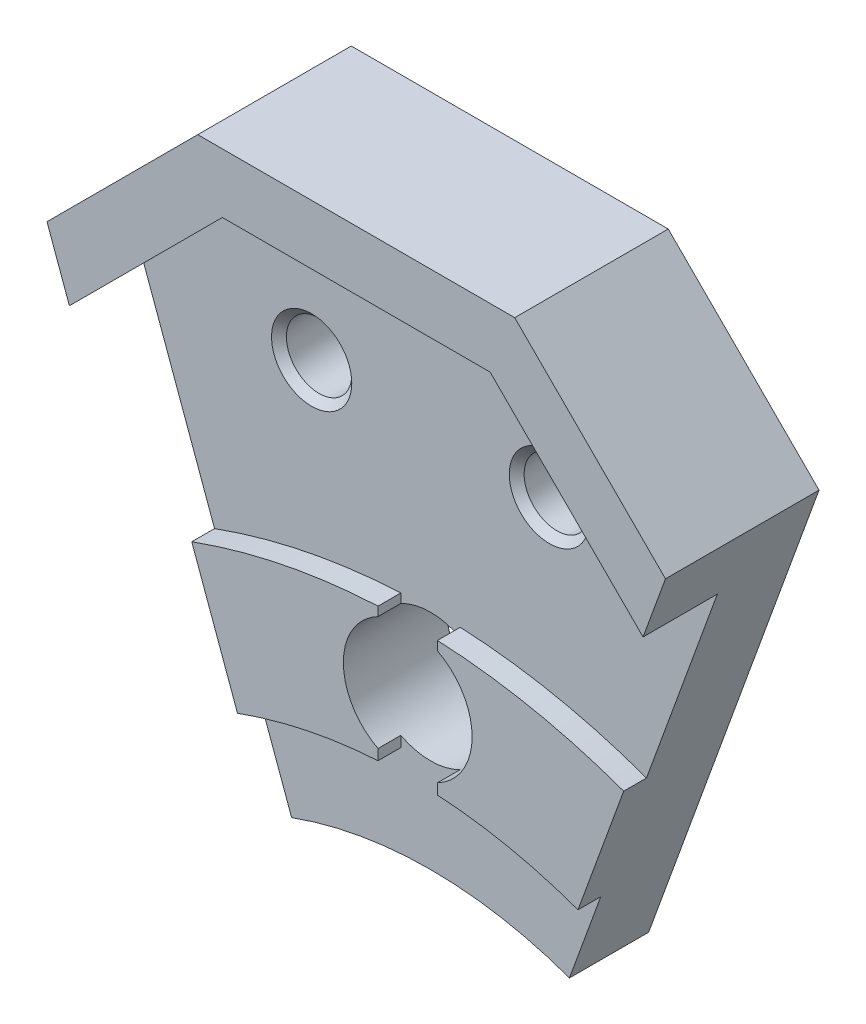
ISO-10303-21;
HEADER;
FILE_DESCRIPTION(('STEP AP214'),'2;1');
FILE_NAME('part.step','',(''),(''),'','','');
FILE_SCHEMA(('AUTOMOTIVE_DESIGN { 1 0 10303 214 1 1 1 1 }'));
ENDSEC;
DATA;
#1=APPLICATION_CONTEXT('core data for automotive mechanical design processes');
#2=APPLICATION_PROTOCOL_DEFINITION('international standard','automotive_design',2000,#1);
#3=PRODUCT_CONTEXT('',#1,'mechanical');
#4=PRODUCT('Part','Part','',(#3));
#5=PRODUCT_RELATED_PRODUCT_CATEGORY('part','',(#4));
#6=PRODUCT_DEFINITION_FORMATION('','',#4);
#7=PRODUCT_DEFINITION_CONTEXT('part definition',#1,'design');
#8=PRODUCT_DEFINITION('design','',#6,#7);
#9=PRODUCT_DEFINITION_SHAPE('','',#8);
#10=(LENGTH_UNIT() NAMED_UNIT(*) SI_UNIT(.MILLI.,.METRE.));
#11=(NAMED_UNIT(*) PLANE_ANGLE_UNIT() SI_UNIT($,.RADIAN.));
#12=(NAMED_UNIT(*) SI_UNIT($,.STERADIAN.) SOLID_ANGLE_UNIT());
#13=UNCERTAINTY_MEASURE_WITH_UNIT(LENGTH_MEASURE(1.E-05),#10,'distance_accuracy_value','');
#14=(GEOMETRIC_REPRESENTATION_CONTEXT(3) GLOBAL_UNCERTAINTY_ASSIGNED_CONTEXT((#13)) GLOBAL_UNIT_ASSIGNED_CONTEXT((#10,
#11,#12)) REPRESENTATION_CONTEXT('',''));
#15=CARTESIAN_POINT('',(0.,0.,0.));
#16=DIRECTION('',(0.,0.,1.));
#17=DIRECTION('',(1.,0.,0.));
#18=AXIS2_PLACEMENT_3D('',#15,#16,#17);
#19=CARTESIAN_POINT('',(0.,0.,2.));
#20=DIRECTION('',(0.,0.,1.));
#21=DIRECTION('',(1.,0.,0.));
#22=AXIS2_PLACEMENT_3D('',#19,#20,#21);
#23=PLANE('',#22);
#24=DIRECTION('',(0.,-1.,0.));
#25=VECTOR('',#24,1.);
#26=CARTESIAN_POINT('',(-1.49999999999999,0.,2.));
#27=LINE('',#26,#25);
#28=CARTESIAN_POINT('',(-1.5,25.6168593513323,2.));
#29=VERTEX_POINT('',#28);
#30=CARTESIAN_POINT('',(-1.5,25.080183910809,2.));
#31=VERTEX_POINT('',#30);
#32=EDGE_CURVE('E55',#29,#31,#27,.T.);
#33=ORIENTED_EDGE('',*,*,#32,.T.);
#34=CARTESIAN_POINT('',(0.,0.,2.));
#35=DIRECTION('',(0.,0.,1.));
#36=DIRECTION('',(1.,0.,0.));
#37=AXIS2_PLACEMENT_3D('',#34,#35,#36);
#38=CIRCLE('',#37,25.125);
#39=CARTESIAN_POINT('',(-8.59325610105729,23.609777097246,2.));
#40=VERTEX_POINT('',#39);
#41=EDGE_CURVE('E223',#31,#40,#38,.T.);
#42=ORIENTED_EDGE('',*,*,#41,.T.);
#43=DIRECTION('',(0.342020143325669,-0.939692620785908,0.));
#44=VECTOR('',#43,1.);
#45=CARTESIAN_POINT('',(-7.01141293817607,19.2636987261112,2.));
#46=LINE('',#45,#44);
#47=CARTESIAN_POINT('',(-7.01141293817607,19.2636987261112,2.));
#48=VERTEX_POINT('',#47);
#49=EDGE_CURVE('E206',#40,#48,#46,.T.);
#50=ORIENTED_EDGE('',*,*,#49,.T.);
#51=CARTESIAN_POINT('',(0.,0.,2.));
#52=DIRECTION('',(0.,0.,-1.));
#53=DIRECTION('',(1.,0.,0.));
#54=AXIS2_PLACEMENT_3D('',#51,#52,#53);
#55=CIRCLE('',#54,20.5);
#56=CARTESIAN_POINT('',(7.01141293817622,19.2636987261111,2.));
#57=VERTEX_POINT('',#56);
#58=EDGE_CURVE('E313',#48,#57,#55,.T.);
#59=ORIENTED_EDGE('',*,*,#58,.T.);
#60=DIRECTION('',(0.342020143325663,0.93969262078591,0.));
#61=VECTOR('',#60,1.);
#62=CARTESIAN_POINT('',(7.01141293817622,19.2636987261111,2.));
#63=LINE('',#62,#61);
#64=CARTESIAN_POINT('',(8.59325610105742,23.609777097246,2.));
#65=VERTEX_POINT('',#64);
#66=EDGE_CURVE('E316',#57,#65,#63,.T.);
#67=ORIENTED_EDGE('',*,*,#66,.T.);
#68=CARTESIAN_POINT('',(0.,0.,2.));
#69=DIRECTION('',(0.,0.,1.));
#70=DIRECTION('',(1.,0.,0.));
#71=AXIS2_PLACEMENT_3D('',#68,#69,#70);
#72=CIRCLE('',#71,25.125);
#73=CARTESIAN_POINT('',(1.5,25.080183910809,2.));
#74=VERTEX_POINT('',#73);
#75=EDGE_CURVE('E264',#65,#74,#72,.T.);
#76=ORIENTED_EDGE('',*,*,#75,.T.);
#77=DIRECTION('',(0.,1.,0.));
#78=VECTOR('',#77,1.);
#79=CARTESIAN_POINT('',(1.49999999999999,0.,2.));
#80=LINE('',#79,#78);
#81=CARTESIAN_POINT('',(1.5,25.6168593513323,2.));
#82=VERTEX_POINT('',#81);
#83=EDGE_CURVE('E255',#74,#82,#80,.T.);
#84=ORIENTED_EDGE('',*,*,#83,.T.);
#85=CARTESIAN_POINT('',(0.,28.5,2.));
#86=DIRECTION('',(0.,0.,1.));
#87=DIRECTION('',(1.,0.,0.));
#88=AXIS2_PLACEMENT_3D('',#85,#86,#87);
#89=CIRCLE('',#88,3.25);
#90=EDGE_CURVE('E308',#29,#82,#89,.T.);
#91=ORIENTED_EDGE('',*,*,#90,.F.);
#92=EDGE_LOOP('',(#33,#42,#50,#59,#67,#76,#84,#91));
#93=FACE_BOUND('',#92,.T.);
#94=ADVANCED_FACE('F40',(#93),#23,.T.);
#95=CARTESIAN_POINT('',(-6.,39.7720779386421,2.));
#96=DIRECTION('',(0.,0.,1.));
#97=DIRECTION('',(1.,0.,0.));
#98=AXIS2_PLACEMENT_3D('',#95,#96,#97);
#99=CIRCLE('',#98,2.025);
#100=CARTESIAN_POINT('',(-3.975,39.7720779386421,2.));
#101=VERTEX_POINT('',#100);
#102=EDGE_CURVE('E782',#101,#101,#99,.T.);
#103=ORIENTED_EDGE('',*,*,#102,.F.);
#104=EDGE_LOOP('',(#103));
#105=FACE_BOUND('',#104,.T.);
#106=CARTESIAN_POINT('',(6.,39.7720779386421,2.));
#107=DIRECTION('',(0.,0.,1.));
#108=DIRECTION('',(1.,0.,0.));
#109=AXIS2_PLACEMENT_3D('',#106,#107,#108);
#110=CIRCLE('',#109,2.025);
#111=CARTESIAN_POINT('',(8.025,39.7720779386421,2.));
#112=VERTEX_POINT('',#111);
#113=EDGE_CURVE('E789',#112,#112,#110,.T.);
#114=ORIENTED_EDGE('',*,*,#113,.F.);
#115=EDGE_LOOP('',(#114));
#116=FACE_BOUND('',#115,.T.);
#117=CARTESIAN_POINT('',(0.,0.,2.));
#118=DIRECTION('',(0.,0.,1.));
#119=DIRECTION('',(1.,0.,0.));
#120=AXIS2_PLACEMENT_3D('',#117,#118,#119);
#121=CIRCLE('',#120,31.875);
#122=CARTESIAN_POINT('',(-10.9018920685056,29.9527022875509,2.));
#123=VERTEX_POINT('',#122);
#124=CARTESIAN_POINT('',(-1.5,31.839686320691,2.));
#125=VERTEX_POINT('',#124);
#126=EDGE_CURVE('E63',#123,#125,#121,.F.);
#127=ORIENTED_EDGE('',*,*,#126,.T.);
#128=DIRECTION('',(0.,-1.,0.));
#129=VECTOR('',#128,1.);
#130=CARTESIAN_POINT('',(-1.5,0.,2.));
#131=LINE('',#130,#129);
#132=CARTESIAN_POINT('',(-1.5,31.3831406486677,2.));
#133=VERTEX_POINT('',#132);
#134=EDGE_CURVE('E213',#125,#133,#131,.T.);
#135=ORIENTED_EDGE('',*,*,#134,.T.);
#136=CARTESIAN_POINT('',(1.5,31.3831406486677,2.));
#137=VERTEX_POINT('',#136);
#138=EDGE_CURVE('E304',#137,#133,#89,.T.);
#139=ORIENTED_EDGE('',*,*,#138,.F.);
#140=DIRECTION('',(0.,1.,0.));
#141=VECTOR('',#140,1.);
#142=CARTESIAN_POINT('',(1.50000000000003,0.,2.));
#143=LINE('',#142,#141);
#144=CARTESIAN_POINT('',(1.5,31.839686320691,2.));
#145=VERTEX_POINT('',#144);
#146=EDGE_CURVE('E258',#137,#145,#143,.T.);
#147=ORIENTED_EDGE('',*,*,#146,.T.);
#148=CARTESIAN_POINT('',(0.,0.,2.));
#149=DIRECTION('',(0.,0.,1.));
#150=DIRECTION('',(1.,0.,0.));
#151=AXIS2_PLACEMENT_3D('',#148,#149,#150);
#152=CIRCLE('',#151,31.875);
#153=CARTESIAN_POINT('',(10.9018920685056,29.9527022875508,2.));
#154=VERTEX_POINT('',#153);
#155=EDGE_CURVE('E261',#145,#154,#152,.F.);
#156=ORIENTED_EDGE('',*,*,#155,.T.);
#157=CARTESIAN_POINT('',(14.4783685770084,39.7789907358724,2.));
#158=VERTEX_POINT('',#157);
#159=EDGE_CURVE('E315',#154,#158,#63,.T.);
#160=ORIENTED_EDGE('',*,*,#159,.T.);
#161=DIRECTION('',(-0.707106781186551,0.707106781186544,0.));
#162=VECTOR('',#161,1.);
#163=CARTESIAN_POINT('',(27.1286796564403,27.1286796564406,2.));
#164=LINE('',#163,#162);
#165=CARTESIAN_POINT('',(6.75735931288072,47.5,2.));
#166=VERTEX_POINT('',#165);
#167=EDGE_CURVE('E297',#158,#166,#164,.T.);
#168=ORIENTED_EDGE('',*,*,#167,.T.);
#169=DIRECTION('',(-1.,0.,0.));
#170=VECTOR('',#169,1.);
#171=CARTESIAN_POINT('',(0.,47.5,2.));
#172=LINE('',#171,#170);
#173=CARTESIAN_POINT('',(-6.75735931288072,47.5,2.));
#174=VERTEX_POINT('',#173);
#175=EDGE_CURVE('E11',#166,#174,#172,.T.);
#176=ORIENTED_EDGE('',*,*,#175,.T.);
#177=DIRECTION('',(-0.707106781186551,-0.707106781186544,0.));
#178=VECTOR('',#177,1.);
#179=CARTESIAN_POINT('',(-27.1286796564403,27.1286796564406,2.));
#180=LINE('',#179,#178);
#181=CARTESIAN_POINT('',(-14.4783685770084,39.7789907358724,2.));
#182=VERTEX_POINT('',#181);
#183=EDGE_CURVE('E300',#174,#182,#180,.T.);
#184=ORIENTED_EDGE('',*,*,#183,.T.);
#185=EDGE_CURVE('E311',#182,#123,#46,.T.);
#186=ORIENTED_EDGE('',*,*,#185,.T.);
#187=EDGE_LOOP('',(#127,#135,#139,#147,#156,#160,#168,#176,#184,#186));
#188=FACE_BOUND('',#187,.T.);
#189=ADVANCED_FACE('F409',(#105,#116,#188),#23,.T.);
#190=CARTESIAN_POINT('',(0.,0.,-2.));
#191=DIRECTION('',(0.,0.,1.));
#192=DIRECTION('',(1.,0.,0.));
#193=AXIS2_PLACEMENT_3D('',#190,#191,#192);
#194=PLANE('',#193);
#195=CARTESIAN_POINT('',(-6.,39.7720779386421,-2.));
#196=DIRECTION('',(0.,0.,1.));
#197=DIRECTION('',(1.,0.,0.));
#198=AXIS2_PLACEMENT_3D('',#195,#196,#197);
#199=CIRCLE('',#198,1.64999999999999);
#200=CARTESIAN_POINT('',(-4.35000000000001,39.7720779386421,-2.));
#201=VERTEX_POINT('',#200);
#202=EDGE_CURVE('E784',#201,#201,#199,.T.);
#203=ORIENTED_EDGE('',*,*,#202,.T.);
#204=EDGE_LOOP('',(#203));
#205=FACE_BOUND('',#204,.T.);
#206=CARTESIAN_POINT('',(6.,39.7720779386421,-2.));
#207=DIRECTION('',(0.,0.,1.));
#208=DIRECTION('',(1.,0.,0.));
#209=AXIS2_PLACEMENT_3D('',#206,#207,#208);
#210=CIRCLE('',#209,1.64999999999999);
#211=CARTESIAN_POINT('',(7.64999999999999,39.7720779386421,-2.));
#212=VERTEX_POINT('',#211);
#213=EDGE_CURVE('E378',#212,#212,#210,.T.);
#214=ORIENTED_EDGE('',*,*,#213,.T.);
#215=EDGE_LOOP('',(#214));
#216=FACE_BOUND('',#215,.T.);
#217=DIRECTION('',(-0.707106781186551,-0.707106781186544,0.));
#218=VECTOR('',#217,1.);
#219=CARTESIAN_POINT('',(-8.,50.5,-2.));
#220=LINE('',#219,#218);
#221=CARTESIAN_POINT('',(-8.,50.5,-2.));
#222=VERTEX_POINT('',#221);
#223=CARTESIAN_POINT('',(-15.6105009989662,42.8894990010339,-2.));
#224=VERTEX_POINT('',#223);
#225=EDGE_CURVE('E307',#222,#224,#220,.T.);
#226=ORIENTED_EDGE('',*,*,#225,.F.);
#227=DIRECTION('',(-1.,0.,0.));
#228=VECTOR('',#227,1.);
#229=CARTESIAN_POINT('',(-8.,50.5,-2.));
#230=LINE('',#229,#228);
#231=CARTESIAN_POINT('',(8.,50.5,-2.));
#232=VERTEX_POINT('',#231);
#233=EDGE_CURVE('E332',#232,#222,#230,.T.);
#234=ORIENTED_EDGE('',*,*,#233,.F.);
#235=DIRECTION('',(-0.707106781186551,0.707106781186544,0.));
#236=VECTOR('',#235,1.);
#237=CARTESIAN_POINT('',(8.,50.5,-2.));
#238=LINE('',#237,#236);
#239=CARTESIAN_POINT('',(15.6105009989662,42.8894990010339,-2.));
#240=VERTEX_POINT('',#239);
#241=EDGE_CURVE('E329',#240,#232,#238,.T.);
#242=ORIENTED_EDGE('',*,*,#241,.F.);
#243=DIRECTION('',(0.342020143325663,0.93969262078591,0.));
#244=VECTOR('',#243,1.);
#245=CARTESIAN_POINT('',(7.01141293817622,19.2636987261111,-2.));
#246=LINE('',#245,#244);
#247=CARTESIAN_POINT('',(7.01141293817622,19.2636987261111,-2.));
#248=VERTEX_POINT('',#247);
#249=EDGE_CURVE('E326',#248,#240,#246,.T.);
#250=ORIENTED_EDGE('',*,*,#249,.F.);
#251=CARTESIAN_POINT('',(0.,0.,-2.));
#252=DIRECTION('',(0.,0.,-1.));
#253=DIRECTION('',(1.,0.,0.));
#254=AXIS2_PLACEMENT_3D('',#251,#252,#253);
#255=CIRCLE('',#254,20.5);
#256=CARTESIAN_POINT('',(-7.01141293817607,19.2636987261112,-2.));
#257=VERTEX_POINT('',#256);
#258=EDGE_CURVE('E324',#257,#248,#255,.T.);
#259=ORIENTED_EDGE('',*,*,#258,.F.);
#260=DIRECTION('',(0.342020143325669,-0.939692620785908,0.));
#261=VECTOR('',#260,1.);
#262=CARTESIAN_POINT('',(-7.01141293817607,19.2636987261112,-2.));
#263=LINE('',#262,#261);
#264=EDGE_CURVE('E322',#224,#257,#263,.T.);
#265=ORIENTED_EDGE('',*,*,#264,.F.);
#266=EDGE_LOOP('',(#226,#234,#242,#250,#259,#265));
#267=FACE_BOUND('',#266,.T.);
#268=CARTESIAN_POINT('',(0.,28.5,-2.));
#269=DIRECTION('',(0.,0.,1.));
#270=DIRECTION('',(1.,0.,0.));
#271=AXIS2_PLACEMENT_3D('',#268,#269,#270);
#272=CIRCLE('',#271,3.25);
#273=CARTESIAN_POINT('',(3.25,28.5,-2.));
#274=VERTEX_POINT('',#273);
#275=EDGE_CURVE('E303',#274,#274,#272,.T.);
#276=ORIENTED_EDGE('',*,*,#275,.T.);
#277=EDGE_LOOP('',(#276));
#278=FACE_BOUND('',#277,.T.);
#279=ADVANCED_FACE('F353',(#205,#216,#267,#278),#194,.F.);
#280=CARTESIAN_POINT('',(-8.,50.5,2.));
#281=DIRECTION('',(0.707106781186544,-0.707106781186551,0.));
#282=DIRECTION('',(0.707106781186551,0.707106781186544,0.));
#283=AXIS2_PLACEMENT_3D('',#280,#281,#282);
#284=PLANE('',#283);
#285=DIRECTION('',(0.,0.,-1.));
#286=VECTOR('',#285,1.);
#287=CARTESIAN_POINT('',(-8.,50.5,2.));
#288=LINE('',#287,#286);
#289=CARTESIAN_POINT('',(-8.,50.5,5.75));
#290=VERTEX_POINT('',#289);
#291=EDGE_CURVE('E319',#290,#222,#288,.T.);
#292=ORIENTED_EDGE('',*,*,#291,.T.);
#293=ORIENTED_EDGE('',*,*,#225,.T.);
#294=DIRECTION('',(0.,0.,-1.));
#295=VECTOR('',#294,1.);
#296=CARTESIAN_POINT('',(-15.6105009989662,42.8894990010339,2.));
#297=LINE('',#296,#295);
#298=CARTESIAN_POINT('',(-15.6105009989662,42.8894990010339,5.75));
#299=VERTEX_POINT('',#298);
#300=EDGE_CURVE('E48',#299,#224,#297,.T.);
#301=ORIENTED_EDGE('',*,*,#300,.F.);
#302=DIRECTION('',(-0.707106781186551,-0.707106781186544,0.));
#303=VECTOR('',#302,1.);
#304=CARTESIAN_POINT('',(-8.,50.5,5.75));
#305=LINE('',#304,#303);
#306=EDGE_CURVE('E276',#290,#299,#305,.T.);
#307=ORIENTED_EDGE('',*,*,#306,.F.);
#308=EDGE_LOOP('',(#292,#293,#301,#307));
#309=FACE_BOUND('',#308,.T.);
#310=ADVANCED_FACE('F42',(#309),#284,.F.);
#311=CARTESIAN_POINT('',(-7.01141293817607,19.2636987261112,2.));
#312=DIRECTION('',(0.939692620785908,0.342020143325669,0.));
#313=DIRECTION('',(-0.342020143325669,0.939692620785908,0.));
#314=AXIS2_PLACEMENT_3D('',#311,#312,#313);
#315=PLANE('',#314);
#316=ORIENTED_EDGE('',*,*,#49,.F.);
#317=DIRECTION('',(0.,0.,-1.));
#318=VECTOR('',#317,1.);
#319=CARTESIAN_POINT('',(-8.59325610105729,23.609777097246,3.15));
#320=LINE('',#319,#318);
#321=CARTESIAN_POINT('',(-8.59325610105729,23.609777097246,3.15));
#322=VERTEX_POINT('',#321);
#323=EDGE_CURVE('E201',#322,#40,#320,.T.);
#324=ORIENTED_EDGE('',*,*,#323,.F.);
#325=DIRECTION('',(0.342020143325669,-0.939692620785908,0.));
#326=VECTOR('',#325,1.);
#327=CARTESIAN_POINT('',(-10.9018920685056,29.9527022875509,3.15));
#328=LINE('',#327,#326);
#329=CARTESIAN_POINT('',(-10.9018920685056,29.9527022875509,3.15));
#330=VERTEX_POINT('',#329);
#331=EDGE_CURVE('E190',#330,#322,#328,.T.);
#332=ORIENTED_EDGE('',*,*,#331,.F.);
#333=DIRECTION('',(0.,0.,-1.));
#334=VECTOR('',#333,1.);
#335=CARTESIAN_POINT('',(-10.9018920685056,29.9527022875509,3.15));
#336=LINE('',#335,#334);
#337=EDGE_CURVE('E208',#330,#123,#336,.T.);
#338=ORIENTED_EDGE('',*,*,#337,.T.);
#339=ORIENTED_EDGE('',*,*,#185,.F.);
#340=DIRECTION('',(0.,0.,-1.));
#341=VECTOR('',#340,1.);
#342=CARTESIAN_POINT('',(-14.4783685770084,39.7789907358724,5.75));
#343=LINE('',#342,#341);
#344=CARTESIAN_POINT('',(-14.4783685770084,39.7789907358724,5.75));
#345=VERTEX_POINT('',#344);
#346=EDGE_CURVE('E295',#345,#182,#343,.T.);
#347=ORIENTED_EDGE('',*,*,#346,.F.);
#348=DIRECTION('',(0.342020143325669,-0.939692620785908,0.));
#349=VECTOR('',#348,1.);
#350=CARTESIAN_POINT('',(-15.6105009989662,42.8894990010339,5.75));
#351=LINE('',#350,#349);
#352=EDGE_CURVE('E279',#299,#345,#351,.T.);
#353=ORIENTED_EDGE('',*,*,#352,.F.);
#354=ORIENTED_EDGE('',*,*,#300,.T.);
#355=ORIENTED_EDGE('',*,*,#264,.T.);
#356=DIRECTION('',(0.,0.,-1.));
#357=VECTOR('',#356,1.);
#358=CARTESIAN_POINT('',(-7.01141293817607,19.2636987261112,2.));
#359=LINE('',#358,#357);
#360=EDGE_CURVE('E343',#48,#257,#359,.T.);
#361=ORIENTED_EDGE('',*,*,#360,.F.);
#362=EDGE_LOOP('',(#316,#324,#332,#338,#339,#347,#353,#354,#355,#361));
#363=FACE_BOUND('',#362,.T.);
#364=ADVANCED_FACE('F204',(#363),#315,.F.);
#365=CARTESIAN_POINT('',(0.,0.,2.));
#366=DIRECTION('',(0.,0.,-1.));
#367=DIRECTION('',(-1.,0.,0.));
#368=AXIS2_PLACEMENT_3D('',#365,#366,#367);
#369=CYLINDRICAL_SURFACE('',#368,20.5);
#370=ORIENTED_EDGE('',*,*,#258,.T.);
#371=DIRECTION('',(0.,0.,-1.));
#372=VECTOR('',#371,1.);
#373=CARTESIAN_POINT('',(7.01141293817622,19.2636987261111,2.));
#374=LINE('',#373,#372);
#375=EDGE_CURVE('E340',#57,#248,#374,.T.);
#376=ORIENTED_EDGE('',*,*,#375,.F.);
#377=ORIENTED_EDGE('',*,*,#58,.F.);
#378=ORIENTED_EDGE('',*,*,#360,.T.);
#379=EDGE_LOOP('',(#370,#376,#377,#378));
#380=FACE_BOUND('',#379,.T.);
#381=ADVANCED_FACE('F372',(#380),#369,.F.);
#382=CARTESIAN_POINT('',(7.01141293817622,19.2636987261111,2.));
#383=DIRECTION('',(-0.93969262078591,0.342020143325663,0.));
#384=DIRECTION('',(-0.342020143325663,-0.939692620785911,0.));
#385=AXIS2_PLACEMENT_3D('',#382,#383,#384);
#386=PLANE('',#385);
#387=ORIENTED_EDGE('',*,*,#159,.F.);
#388=DIRECTION('',(0.,0.,-1.));
#389=VECTOR('',#388,1.);
#390=CARTESIAN_POINT('',(10.9018920685056,29.9527022875508,3.15));
#391=LINE('',#390,#389);
#392=CARTESIAN_POINT('',(10.9018920685056,29.9527022875508,3.15));
#393=VERTEX_POINT('',#392);
#394=EDGE_CURVE('E250',#393,#154,#391,.T.);
#395=ORIENTED_EDGE('',*,*,#394,.F.);
#396=DIRECTION('',(0.342020143325663,0.93969262078591,0.));
#397=VECTOR('',#396,1.);
#398=CARTESIAN_POINT('',(8.59325610105742,23.609777097246,3.15));
#399=LINE('',#398,#397);
#400=CARTESIAN_POINT('',(8.59325610105742,23.609777097246,3.15));
#401=VERTEX_POINT('',#400);
#402=EDGE_CURVE('E228',#401,#393,#399,.T.);
#403=ORIENTED_EDGE('',*,*,#402,.F.);
#404=DIRECTION('',(0.,0.,-1.));
#405=VECTOR('',#404,1.);
#406=CARTESIAN_POINT('',(8.59325610105742,23.609777097246,3.15));
#407=LINE('',#406,#405);
#408=EDGE_CURVE('E252',#401,#65,#407,.T.);
#409=ORIENTED_EDGE('',*,*,#408,.T.);
#410=ORIENTED_EDGE('',*,*,#66,.F.);
#411=ORIENTED_EDGE('',*,*,#375,.T.);
#412=ORIENTED_EDGE('',*,*,#249,.T.);
#413=DIRECTION('',(0.,0.,-1.));
#414=VECTOR('',#413,1.);
#415=CARTESIAN_POINT('',(15.6105009989662,42.8894990010339,2.));
#416=LINE('',#415,#414);
#417=CARTESIAN_POINT('',(15.6105009989662,42.8894990010339,5.75));
#418=VERTEX_POINT('',#417);
#419=EDGE_CURVE('E338',#418,#240,#416,.T.);
#420=ORIENTED_EDGE('',*,*,#419,.F.);
#421=DIRECTION('',(0.342020143325663,0.939692620785911,0.));
#422=VECTOR('',#421,1.);
#423=CARTESIAN_POINT('',(14.4783685770084,39.7789907358724,5.75));
#424=LINE('',#423,#422);
#425=CARTESIAN_POINT('',(14.4783685770084,39.7789907358724,5.75));
#426=VERTEX_POINT('',#425);
#427=EDGE_CURVE('E267',#426,#418,#424,.T.);
#428=ORIENTED_EDGE('',*,*,#427,.F.);
#429=DIRECTION('',(0.,0.,-1.));
#430=VECTOR('',#429,1.);
#431=CARTESIAN_POINT('',(14.4783685770084,39.7789907358724,5.75));
#432=LINE('',#431,#430);
#433=EDGE_CURVE('E287',#426,#158,#432,.T.);
#434=ORIENTED_EDGE('',*,*,#433,.T.);
#435=EDGE_LOOP('',(#387,#395,#403,#409,#410,#411,#412,#420,#428,#434));
#436=FACE_BOUND('',#435,.T.);
#437=ADVANCED_FACE('F367',(#436),#386,.F.);
#438=CARTESIAN_POINT('',(8.,50.5,2.));
#439=DIRECTION('',(-0.707106781186544,-0.707106781186551,0.));
#440=DIRECTION('',(0.707106781186551,-0.707106781186544,0.));
#441=AXIS2_PLACEMENT_3D('',#438,#439,#440);
#442=PLANE('',#441);
#443=ORIENTED_EDGE('',*,*,#419,.T.);
#444=ORIENTED_EDGE('',*,*,#241,.T.);
#445=DIRECTION('',(0.,0.,-1.));
#446=VECTOR('',#445,1.);
#447=CARTESIAN_POINT('',(8.,50.5,2.));
#448=LINE('',#447,#446);
#449=CARTESIAN_POINT('',(8.,50.5,5.75));
#450=VERTEX_POINT('',#449);
#451=EDGE_CURVE('E336',#450,#232,#448,.T.);
#452=ORIENTED_EDGE('',*,*,#451,.F.);
#453=DIRECTION('',(-0.707106781186551,0.707106781186544,0.));
#454=VECTOR('',#453,1.);
#455=CARTESIAN_POINT('',(15.6105009989662,42.8894990010339,5.75));
#456=LINE('',#455,#454);
#457=EDGE_CURVE('E270',#418,#450,#456,.T.);
#458=ORIENTED_EDGE('',*,*,#457,.F.);
#459=EDGE_LOOP('',(#443,#444,#452,#458));
#460=FACE_BOUND('',#459,.T.);
#461=ADVANCED_FACE('F362',(#460),#442,.F.);
#462=CARTESIAN_POINT('',(-8.,50.5,2.));
#463=DIRECTION('',(0.,-1.,0.));
#464=DIRECTION('',(0.,0.,-1.));
#465=AXIS2_PLACEMENT_3D('',#462,#463,#464);
#466=PLANE('',#465);
#467=ORIENTED_EDGE('',*,*,#451,.T.);
#468=ORIENTED_EDGE('',*,*,#233,.T.);
#469=ORIENTED_EDGE('',*,*,#291,.F.);
#470=DIRECTION('',(-1.,0.,0.));
#471=VECTOR('',#470,1.);
#472=CARTESIAN_POINT('',(8.,50.5,5.75));
#473=LINE('',#472,#471);
#474=EDGE_CURVE('E273',#450,#290,#473,.T.);
#475=ORIENTED_EDGE('',*,*,#474,.F.);
#476=EDGE_LOOP('',(#467,#468,#469,#475));
#477=FACE_BOUND('',#476,.T.);
#478=ADVANCED_FACE('F359',(#477),#466,.F.);
#479=CARTESIAN_POINT('',(0.,28.5,2.));
#480=DIRECTION('',(0.,0.,-1.));
#481=DIRECTION('',(-1.,0.,0.));
#482=AXIS2_PLACEMENT_3D('',#479,#480,#481);
#483=CYLINDRICAL_SURFACE('',#482,3.25);
#484=ORIENTED_EDGE('',*,*,#138,.T.);
#485=DIRECTION('',(0.,0.,-1.));
#486=VECTOR('',#485,1.);
#487=CARTESIAN_POINT('',(-1.5,31.3831406486677,3.15));
#488=LINE('',#487,#486);
#489=CARTESIAN_POINT('',(-1.5,31.3831406486677,3.15));
#490=VERTEX_POINT('',#489);
#491=EDGE_CURVE('E380',#490,#133,#488,.T.);
#492=ORIENTED_EDGE('',*,*,#491,.F.);
#493=CARTESIAN_POINT('',(0.,28.5,3.15));
#494=DIRECTION('',(0.,0.,-1.));
#495=DIRECTION('',(1.,0.,0.));
#496=AXIS2_PLACEMENT_3D('',#493,#494,#495);
#497=CIRCLE('',#496,3.25);
#498=CARTESIAN_POINT('',(-1.5,25.6168593513323,3.15));
#499=VERTEX_POINT('',#498);
#500=EDGE_CURVE('E217',#499,#490,#497,.T.);
#501=ORIENTED_EDGE('',*,*,#500,.F.);
#502=DIRECTION('',(0.,0.,-1.));
#503=VECTOR('',#502,1.);
#504=CARTESIAN_POINT('',(-1.5,25.6168593513323,3.15));
#505=LINE('',#504,#503);
#506=EDGE_CURVE('E377',#499,#29,#505,.T.);
#507=ORIENTED_EDGE('',*,*,#506,.T.);
#508=ORIENTED_EDGE('',*,*,#90,.T.);
#509=DIRECTION('',(0.,0.,-1.));
#510=VECTOR('',#509,1.);
#511=CARTESIAN_POINT('',(1.5,25.6168593513323,3.15));
#512=LINE('',#511,#510);
#513=CARTESIAN_POINT('',(1.5,25.6168593513323,3.15));
#514=VERTEX_POINT('',#513);
#515=EDGE_CURVE('E241',#514,#82,#512,.T.);
#516=ORIENTED_EDGE('',*,*,#515,.F.);
#517=CARTESIAN_POINT('',(0.,28.5,3.15));
#518=DIRECTION('',(0.,0.,-1.));
#519=DIRECTION('',(1.,0.,0.));
#520=AXIS2_PLACEMENT_3D('',#517,#518,#519);
#521=CIRCLE('',#520,3.25);
#522=CARTESIAN_POINT('',(1.5,31.3831406486677,3.15));
#523=VERTEX_POINT('',#522);
#524=EDGE_CURVE('E234',#523,#514,#521,.T.);
#525=ORIENTED_EDGE('',*,*,#524,.F.);
#526=DIRECTION('',(0.,0.,-1.));
#527=VECTOR('',#526,1.);
#528=CARTESIAN_POINT('',(1.5,31.3831406486677,3.15));
#529=LINE('',#528,#527);
#530=EDGE_CURVE('E244',#523,#137,#529,.T.);
#531=ORIENTED_EDGE('',*,*,#530,.T.);
#532=EDGE_LOOP('',(#484,#492,#501,#507,#508,#516,#525,#531));
#533=FACE_BOUND('',#532,.T.);
#534=ORIENTED_EDGE('',*,*,#275,.F.);
#535=EDGE_LOOP('',(#534));
#536=FACE_BOUND('',#535,.T.);
#537=ADVANCED_FACE('F400',(#533,#536),#483,.F.);
#538=CARTESIAN_POINT('',(-6.75735931288072,47.5,5.75));
#539=DIRECTION('',(-0.707106781186544,0.707106781186551,0.));
#540=DIRECTION('',(-0.707106781186551,-0.707106781186544,0.));
#541=AXIS2_PLACEMENT_3D('',#538,#539,#540);
#542=PLANE('',#541);
#543=ORIENTED_EDGE('',*,*,#183,.F.);
#544=DIRECTION('',(0.,0.,-1.));
#545=VECTOR('',#544,1.);
#546=CARTESIAN_POINT('',(-6.75735931288072,47.5,5.75));
#547=LINE('',#546,#545);
#548=CARTESIAN_POINT('',(-6.75735931288072,47.5,5.75));
#549=VERTEX_POINT('',#548);
#550=EDGE_CURVE('E292',#549,#174,#547,.T.);
#551=ORIENTED_EDGE('',*,*,#550,.F.);
#552=DIRECTION('',(0.707106781186551,0.707106781186544,0.));
#553=VECTOR('',#552,1.);
#554=CARTESIAN_POINT('',(-6.75735931288072,47.5,5.75));
#555=LINE('',#554,#553);
#556=EDGE_CURVE('E281',#345,#549,#555,.T.);
#557=ORIENTED_EDGE('',*,*,#556,.F.);
#558=ORIENTED_EDGE('',*,*,#346,.T.);
#559=EDGE_LOOP('',(#543,#551,#557,#558));
#560=FACE_BOUND('',#559,.T.);
#561=ADVANCED_FACE('F413',(#560),#542,.F.);
#562=CARTESIAN_POINT('',(6.75735931288072,47.5,5.75));
#563=DIRECTION('',(0.,1.,0.));
#564=DIRECTION('',(0.,0.,1.));
#565=AXIS2_PLACEMENT_3D('',#562,#563,#564);
#566=PLANE('',#565);
#567=ORIENTED_EDGE('',*,*,#175,.F.);
#568=DIRECTION('',(0.,0.,-1.));
#569=VECTOR('',#568,1.);
#570=CARTESIAN_POINT('',(6.75735931288072,47.5,5.75));
#571=LINE('',#570,#569);
#572=CARTESIAN_POINT('',(6.75735931288072,47.5,5.75));
#573=VERTEX_POINT('',#572);
#574=EDGE_CURVE('E290',#573,#166,#571,.T.);
#575=ORIENTED_EDGE('',*,*,#574,.F.);
#576=DIRECTION('',(1.,0.,0.));
#577=VECTOR('',#576,1.);
#578=CARTESIAN_POINT('',(6.75735931288072,47.5,5.75));
#579=LINE('',#578,#577);
#580=EDGE_CURVE('E283',#549,#573,#579,.T.);
#581=ORIENTED_EDGE('',*,*,#580,.F.);
#582=ORIENTED_EDGE('',*,*,#550,.T.);
#583=EDGE_LOOP('',(#567,#575,#581,#582));
#584=FACE_BOUND('',#583,.T.);
#585=ADVANCED_FACE('F416',(#584),#566,.F.);
#586=CARTESIAN_POINT('',(14.4783685770084,39.7789907358724,5.75));
#587=DIRECTION('',(0.707106781186544,0.707106781186551,0.));
#588=DIRECTION('',(-0.707106781186551,0.707106781186544,0.));
#589=AXIS2_PLACEMENT_3D('',#586,#587,#588);
#590=PLANE('',#589);
#591=ORIENTED_EDGE('',*,*,#167,.F.);
#592=ORIENTED_EDGE('',*,*,#433,.F.);
#593=DIRECTION('',(0.707106781186551,-0.707106781186544,0.));
#594=VECTOR('',#593,1.);
#595=CARTESIAN_POINT('',(14.4783685770084,39.7789907358724,5.75));
#596=LINE('',#595,#594);
#597=EDGE_CURVE('E285',#573,#426,#596,.T.);
#598=ORIENTED_EDGE('',*,*,#597,.F.);
#599=ORIENTED_EDGE('',*,*,#574,.T.);
#600=EDGE_LOOP('',(#591,#592,#598,#599));
#601=FACE_BOUND('',#600,.T.);
#602=ADVANCED_FACE('F425',(#601),#590,.F.);
#603=CARTESIAN_POINT('',(0.,0.,5.75));
#604=DIRECTION('',(0.,0.,1.));
#605=DIRECTION('',(1.,0.,0.));
#606=AXIS2_PLACEMENT_3D('',#603,#604,#605);
#607=PLANE('',#606);
#608=ORIENTED_EDGE('',*,*,#427,.T.);
#609=ORIENTED_EDGE('',*,*,#457,.T.);
#610=ORIENTED_EDGE('',*,*,#474,.T.);
#611=ORIENTED_EDGE('',*,*,#306,.T.);
#612=ORIENTED_EDGE('',*,*,#352,.T.);
#613=ORIENTED_EDGE('',*,*,#556,.T.);
#614=ORIENTED_EDGE('',*,*,#580,.T.);
#615=ORIENTED_EDGE('',*,*,#597,.T.);
#616=EDGE_LOOP('',(#608,#609,#610,#611,#612,#613,#614,#615));
#617=FACE_BOUND('',#616,.T.);
#618=ADVANCED_FACE('F420',(#617),#607,.T.);
#619=CARTESIAN_POINT('',(0.,0.,3.15));
#620=DIRECTION('',(0.,0.,-1.));
#621=DIRECTION('',(-1.,0.,0.));
#622=AXIS2_PLACEMENT_3D('',#619,#620,#621);
#623=CYLINDRICAL_SURFACE('',#622,25.125);
#624=ORIENTED_EDGE('',*,*,#75,.F.);
#625=ORIENTED_EDGE('',*,*,#408,.F.);
#626=CARTESIAN_POINT('',(0.,0.,3.15));
#627=DIRECTION('',(0.,0.,-1.));
#628=DIRECTION('',(-1.,0.,0.));
#629=AXIS2_PLACEMENT_3D('',#626,#627,#628);
#630=CIRCLE('',#629,25.125);
#631=CARTESIAN_POINT('',(1.5,25.080183910809,3.15));
#632=VERTEX_POINT('',#631);
#633=EDGE_CURVE('E225',#632,#401,#630,.T.);
#634=ORIENTED_EDGE('',*,*,#633,.F.);
#635=DIRECTION('',(0.,0.,-1.));
#636=VECTOR('',#635,1.);
#637=CARTESIAN_POINT('',(1.5,25.080183910809,3.15));
#638=LINE('',#637,#636);
#639=EDGE_CURVE('E238',#632,#74,#638,.T.);
#640=ORIENTED_EDGE('',*,*,#639,.T.);
#641=EDGE_LOOP('',(#624,#625,#634,#640));
#642=FACE_BOUND('',#641,.T.);
#643=ADVANCED_FACE('F441',(#642),#623,.F.);
#644=CARTESIAN_POINT('',(0.,0.,3.15));
#645=DIRECTION('',(0.,0.,-1.));
#646=DIRECTION('',(-1.,0.,0.));
#647=AXIS2_PLACEMENT_3D('',#644,#645,#646);
#648=CYLINDRICAL_SURFACE('',#647,31.875);
#649=ORIENTED_EDGE('',*,*,#155,.F.);
#650=DIRECTION('',(0.,0.,-1.));
#651=VECTOR('',#650,1.);
#652=CARTESIAN_POINT('',(1.5,31.839686320691,3.15));
#653=LINE('',#652,#651);
#654=CARTESIAN_POINT('',(1.5,31.839686320691,3.15));
#655=VERTEX_POINT('',#654);
#656=EDGE_CURVE('E247',#655,#145,#653,.T.);
#657=ORIENTED_EDGE('',*,*,#656,.F.);
#658=CARTESIAN_POINT('',(0.,0.,3.15));
#659=DIRECTION('',(0.,0.,1.));
#660=DIRECTION('',(-1.,0.,0.));
#661=AXIS2_PLACEMENT_3D('',#658,#659,#660);
#662=CIRCLE('',#661,31.875);
#663=EDGE_CURVE('E230',#393,#655,#662,.T.);
#664=ORIENTED_EDGE('',*,*,#663,.F.);
#665=ORIENTED_EDGE('',*,*,#394,.T.);
#666=EDGE_LOOP('',(#649,#657,#664,#665));
#667=FACE_BOUND('',#666,.T.);
#668=ADVANCED_FACE('F428',(#667),#648,.T.);
#669=CARTESIAN_POINT('',(1.5,31.839686320691,3.15));
#670=DIRECTION('',(1.,0.,0.));
#671=DIRECTION('',(0.,1.,0.));
#672=AXIS2_PLACEMENT_3D('',#669,#670,#671);
#673=PLANE('',#672);
#674=ORIENTED_EDGE('',*,*,#146,.F.);
#675=ORIENTED_EDGE('',*,*,#530,.F.);
#676=DIRECTION('',(0.,-1.,0.));
#677=VECTOR('',#676,1.);
#678=CARTESIAN_POINT('',(1.5,31.839686320691,3.15));
#679=LINE('',#678,#677);
#680=EDGE_CURVE('E232',#655,#523,#679,.T.);
#681=ORIENTED_EDGE('',*,*,#680,.F.);
#682=ORIENTED_EDGE('',*,*,#656,.T.);
#683=EDGE_LOOP('',(#674,#675,#681,#682));
#684=FACE_BOUND('',#683,.T.);
#685=ADVANCED_FACE('F432',(#684),#673,.F.);
#686=CARTESIAN_POINT('',(1.5,25.6168593513323,3.15));
#687=DIRECTION('',(1.,0.,0.));
#688=DIRECTION('',(0.,1.,0.));
#689=AXIS2_PLACEMENT_3D('',#686,#687,#688);
#690=PLANE('',#689);
#691=ORIENTED_EDGE('',*,*,#83,.F.);
#692=ORIENTED_EDGE('',*,*,#639,.F.);
#693=DIRECTION('',(0.,-1.,0.));
#694=VECTOR('',#693,1.);
#695=CARTESIAN_POINT('',(1.5,25.6168593513323,3.15));
#696=LINE('',#695,#694);
#697=EDGE_CURVE('E236',#514,#632,#696,.T.);
#698=ORIENTED_EDGE('',*,*,#697,.F.);
#699=ORIENTED_EDGE('',*,*,#515,.T.);
#700=EDGE_LOOP('',(#691,#692,#698,#699));
#701=FACE_BOUND('',#700,.T.);
#702=ADVANCED_FACE('F444',(#701),#690,.F.);
#703=CARTESIAN_POINT('',(0.,0.,3.15));
#704=DIRECTION('',(0.,0.,-1.));
#705=DIRECTION('',(-1.,0.,0.));
#706=AXIS2_PLACEMENT_3D('',#703,#704,#705);
#707=PLANE('',#706);
#708=ORIENTED_EDGE('',*,*,#633,.T.);
#709=ORIENTED_EDGE('',*,*,#402,.T.);
#710=ORIENTED_EDGE('',*,*,#663,.T.);
#711=ORIENTED_EDGE('',*,*,#680,.T.);
#712=ORIENTED_EDGE('',*,*,#524,.T.);
#713=ORIENTED_EDGE('',*,*,#697,.T.);
#714=EDGE_LOOP('',(#708,#709,#710,#711,#712,#713));
#715=FACE_BOUND('',#714,.T.);
#716=ADVANCED_FACE('F436',(#715),#707,.F.);
#717=CARTESIAN_POINT('',(0.,0.,3.15));
#718=DIRECTION('',(0.,0.,-1.));
#719=DIRECTION('',(-1.,0.,0.));
#720=AXIS2_PLACEMENT_3D('',#717,#718,#719);
#721=CYLINDRICAL_SURFACE('',#720,25.125);
#722=ORIENTED_EDGE('',*,*,#41,.F.);
#723=DIRECTION('',(0.,0.,-1.));
#724=VECTOR('',#723,1.);
#725=CARTESIAN_POINT('',(-1.5,25.080183910809,3.15));
#726=LINE('',#725,#724);
#727=CARTESIAN_POINT('',(-1.5,25.080183910809,3.15));
#728=VERTEX_POINT('',#727);
#729=EDGE_CURVE('E212',#728,#31,#726,.T.);
#730=ORIENTED_EDGE('',*,*,#729,.F.);
#731=CARTESIAN_POINT('',(0.,0.,3.15));
#732=DIRECTION('',(0.,0.,-1.));
#733=DIRECTION('',(-1.,0.,0.));
#734=AXIS2_PLACEMENT_3D('',#731,#732,#733);
#735=CIRCLE('',#734,25.125);
#736=EDGE_CURVE('E194',#322,#728,#735,.T.);
#737=ORIENTED_EDGE('',*,*,#736,.F.);
#738=ORIENTED_EDGE('',*,*,#323,.T.);
#739=EDGE_LOOP('',(#722,#730,#737,#738));
#740=FACE_BOUND('',#739,.T.);
#741=ADVANCED_FACE('F210',(#740),#721,.F.);
#742=CARTESIAN_POINT('',(-1.5,25.6168593513323,3.15));
#743=DIRECTION('',(-1.,0.,0.));
#744=DIRECTION('',(0.,-1.,0.));
#745=AXIS2_PLACEMENT_3D('',#742,#743,#744);
#746=PLANE('',#745);
#747=ORIENTED_EDGE('',*,*,#32,.F.);
#748=ORIENTED_EDGE('',*,*,#506,.F.);
#749=DIRECTION('',(0.,1.,0.));
#750=VECTOR('',#749,1.);
#751=CARTESIAN_POINT('',(-1.5,25.6168593513323,3.15));
#752=LINE('',#751,#750);
#753=EDGE_CURVE('E214',#728,#499,#752,.T.);
#754=ORIENTED_EDGE('',*,*,#753,.F.);
#755=ORIENTED_EDGE('',*,*,#729,.T.);
#756=EDGE_LOOP('',(#747,#748,#754,#755));
#757=FACE_BOUND('',#756,.T.);
#758=ADVANCED_FACE('F374',(#757),#746,.F.);
#759=CARTESIAN_POINT('',(-1.5,31.839686320691,3.15));
#760=DIRECTION('',(-1.,0.,0.));
#761=DIRECTION('',(0.,0.,1.));
#762=AXIS2_PLACEMENT_3D('',#759,#760,#761);
#763=PLANE('',#762);
#764=ORIENTED_EDGE('',*,*,#134,.F.);
#765=DIRECTION('',(0.,0.,-1.));
#766=VECTOR('',#765,1.);
#767=CARTESIAN_POINT('',(-1.5,31.839686320691,3.15));
#768=LINE('',#767,#766);
#769=CARTESIAN_POINT('',(-1.5,31.839686320691,3.15));
#770=VERTEX_POINT('',#769);
#771=EDGE_CURVE('E389',#770,#125,#768,.T.);
#772=ORIENTED_EDGE('',*,*,#771,.F.);
#773=DIRECTION('',(0.,1.,0.));
#774=VECTOR('',#773,1.);
#775=CARTESIAN_POINT('',(-1.5,31.839686320691,3.15));
#776=LINE('',#775,#774);
#777=EDGE_CURVE('E394',#490,#770,#776,.T.);
#778=ORIENTED_EDGE('',*,*,#777,.F.);
#779=ORIENTED_EDGE('',*,*,#491,.T.);
#780=EDGE_LOOP('',(#764,#772,#778,#779));
#781=FACE_BOUND('',#780,.T.);
#782=ADVANCED_FACE('F404',(#781),#763,.F.);
#783=CARTESIAN_POINT('',(0.,0.,3.15));
#784=DIRECTION('',(0.,0.,-1.));
#785=DIRECTION('',(-1.,0.,0.));
#786=AXIS2_PLACEMENT_3D('',#783,#784,#785);
#787=CYLINDRICAL_SURFACE('',#786,31.875);
#788=ORIENTED_EDGE('',*,*,#126,.F.);
#789=ORIENTED_EDGE('',*,*,#337,.F.);
#790=CARTESIAN_POINT('',(0.,0.,3.15));
#791=DIRECTION('',(0.,0.,1.));
#792=DIRECTION('',(-1.,0.,0.));
#793=AXIS2_PLACEMENT_3D('',#790,#791,#792);
#794=CIRCLE('',#793,31.875);
#795=EDGE_CURVE('E197',#770,#330,#794,.T.);
#796=ORIENTED_EDGE('',*,*,#795,.F.);
#797=ORIENTED_EDGE('',*,*,#771,.T.);
#798=EDGE_LOOP('',(#788,#789,#796,#797));
#799=FACE_BOUND('',#798,.T.);
#800=ADVANCED_FACE('F406',(#799),#787,.T.);
#801=CARTESIAN_POINT('',(0.,0.,3.15));
#802=DIRECTION('',(0.,0.,-1.));
#803=DIRECTION('',(-1.,0.,0.));
#804=AXIS2_PLACEMENT_3D('',#801,#802,#803);
#805=PLANE('',#804);
#806=ORIENTED_EDGE('',*,*,#736,.T.);
#807=ORIENTED_EDGE('',*,*,#753,.T.);
#808=ORIENTED_EDGE('',*,*,#500,.T.);
#809=ORIENTED_EDGE('',*,*,#777,.T.);
#810=ORIENTED_EDGE('',*,*,#795,.T.);
#811=ORIENTED_EDGE('',*,*,#331,.T.);
#812=EDGE_LOOP('',(#806,#807,#808,#809,#810,#811));
#813=FACE_BOUND('',#812,.T.);
#814=ADVANCED_FACE('F192',(#813),#805,.F.);
#815=CARTESIAN_POINT('',(6.,39.7720779386421,2.));
#816=DIRECTION('',(0.,0.,1.));
#817=DIRECTION('',(1.,0.,0.));
#818=AXIS2_PLACEMENT_3D('',#815,#816,#817);
#819=CYLINDRICAL_SURFACE('',#818,1.64999999999999);
#820=ORIENTED_EDGE('',*,*,#213,.F.);
#821=EDGE_LOOP('',(#820));
#822=FACE_BOUND('',#821,.T.);
#823=CARTESIAN_POINT('',(6.,39.7720779386421,1.625));
#824=DIRECTION('',(0.,0.,1.));
#825=DIRECTION('',(1.,0.,0.));
#826=AXIS2_PLACEMENT_3D('',#823,#824,#825);
#827=CIRCLE('',#826,1.64999999999999);
#828=CARTESIAN_POINT('',(7.64999999999999,39.7720779386421,1.625));
#829=VERTEX_POINT('',#828);
#830=EDGE_CURVE('E383',#829,#829,#827,.T.);
#831=ORIENTED_EDGE('',*,*,#830,.T.);
#832=EDGE_LOOP('',(#831));
#833=FACE_BOUND('',#832,.T.);
#834=ADVANCED_FACE('F501',(#822,#833),#819,.F.);
#835=CARTESIAN_POINT('',(6.,39.7720779386421,2.));
#836=DIRECTION('',(0.,0.,1.));
#837=DIRECTION('',(1.,0.,0.));
#838=AXIS2_PLACEMENT_3D('',#835,#836,#837);
#839=CONICAL_SURFACE('',#838,2.025,0.78539816339746);
#840=ORIENTED_EDGE('',*,*,#830,.F.);
#841=EDGE_LOOP('',(#840));
#842=FACE_BOUND('',#841,.T.);
#843=ORIENTED_EDGE('',*,*,#113,.T.);
#844=EDGE_LOOP('',(#843));
#845=FACE_BOUND('',#844,.T.);
#846=ADVANCED_FACE('F720',(#842,#845),#839,.F.);
#847=CARTESIAN_POINT('',(-6.,39.7720779386421,2.));
#848=DIRECTION('',(0.,0.,1.));
#849=DIRECTION('',(1.,0.,0.));
#850=AXIS2_PLACEMENT_3D('',#847,#848,#849);
#851=CYLINDRICAL_SURFACE('',#850,1.64999999999999);
#852=ORIENTED_EDGE('',*,*,#202,.F.);
#853=EDGE_LOOP('',(#852));
#854=FACE_BOUND('',#853,.T.);
#855=CARTESIAN_POINT('',(-6.,39.7720779386421,1.625));
#856=DIRECTION('',(0.,0.,1.));
#857=DIRECTION('',(1.,0.,0.));
#858=AXIS2_PLACEMENT_3D('',#855,#856,#857);
#859=CIRCLE('',#858,1.64999999999999);
#860=CARTESIAN_POINT('',(-4.35000000000001,39.7720779386421,1.625));
#861=VERTEX_POINT('',#860);
#862=EDGE_CURVE('E779',#861,#861,#859,.T.);
#863=ORIENTED_EDGE('',*,*,#862,.T.);
#864=EDGE_LOOP('',(#863));
#865=FACE_BOUND('',#864,.T.);
#866=ADVANCED_FACE('F729',(#854,#865),#851,.F.);
#867=CARTESIAN_POINT('',(-6.,39.7720779386421,2.));
#868=DIRECTION('',(0.,0.,1.));
#869=DIRECTION('',(1.,0.,0.));
#870=AXIS2_PLACEMENT_3D('',#867,#868,#869);
#871=CONICAL_SURFACE('',#870,2.025,0.78539816339746);
#872=ORIENTED_EDGE('',*,*,#862,.F.);
#873=EDGE_LOOP('',(#872));
#874=FACE_BOUND('',#873,.T.);
#875=ORIENTED_EDGE('',*,*,#102,.T.);
#876=EDGE_LOOP('',(#875));
#877=FACE_BOUND('',#876,.T.);
#878=ADVANCED_FACE('F739',(#874,#877),#871,.F.);
#879=CLOSED_SHELL('',(#94,#189,#279,#310,#364,#381,#437,#461,#478,#537,#561,#585,#602,#618,#643,
#668,#685,#702,#716,#741,#758,#782,#800,#814,#834,#846,#866,#878));
#880=MANIFOLD_SOLID_BREP('B2',#879);
#881=ADVANCED_BREP_SHAPE_REPRESENTATION('',(#18,#880),#14);
#882=SHAPE_DEFINITION_REPRESENTATION(#9,#881);
ENDSEC;
END-ISO-10303-21;
